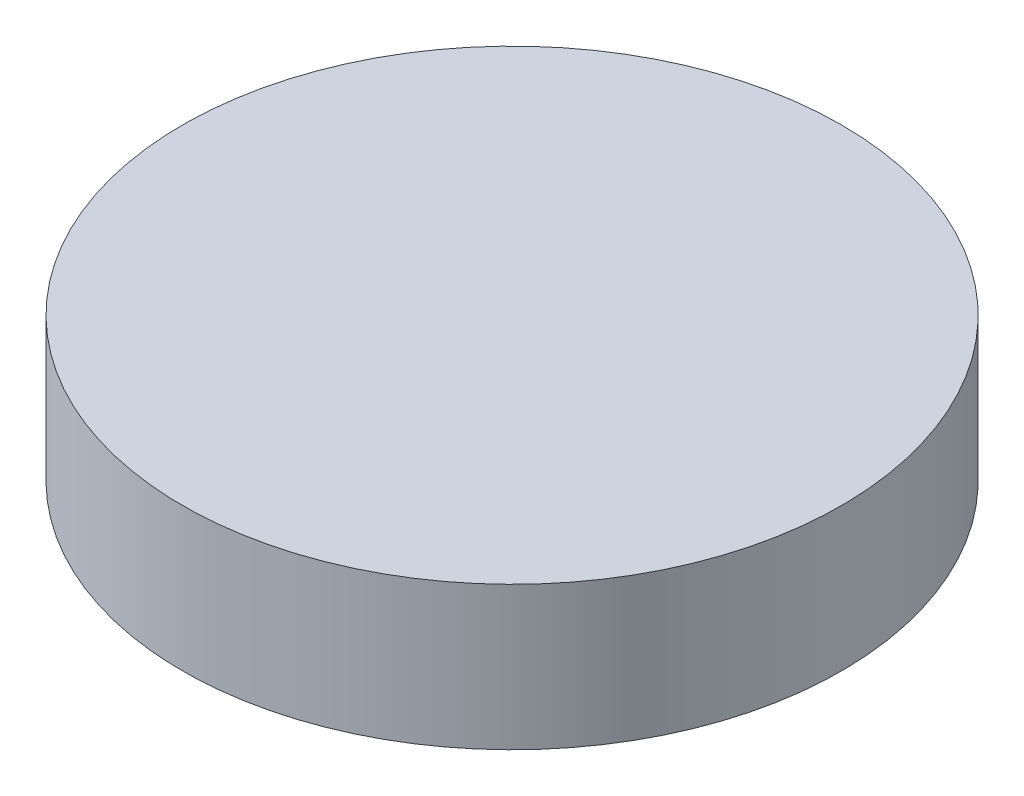
ISO-10303-21;
HEADER;
FILE_DESCRIPTION(('STEP AP214'),'2;1');
FILE_NAME('part.step','',(''),(''),'','','');
FILE_SCHEMA(('AUTOMOTIVE_DESIGN { 1 0 10303 214 1 1 1 1 }'));
ENDSEC;
DATA;
#1=APPLICATION_CONTEXT('core data for automotive mechanical design processes');
#2=APPLICATION_PROTOCOL_DEFINITION('international standard','automotive_design',2000,#1);
#3=PRODUCT_CONTEXT('',#1,'mechanical');
#4=PRODUCT('Part','Part','',(#3));
#5=PRODUCT_RELATED_PRODUCT_CATEGORY('part','',(#4));
#6=PRODUCT_DEFINITION_FORMATION('','',#4);
#7=PRODUCT_DEFINITION_CONTEXT('part definition',#1,'design');
#8=PRODUCT_DEFINITION('design','',#6,#7);
#9=PRODUCT_DEFINITION_SHAPE('','',#8);
#10=(LENGTH_UNIT() NAMED_UNIT(*) SI_UNIT(.MILLI.,.METRE.));
#11=(NAMED_UNIT(*) PLANE_ANGLE_UNIT() SI_UNIT($,.RADIAN.));
#12=(NAMED_UNIT(*) SI_UNIT($,.STERADIAN.) SOLID_ANGLE_UNIT());
#13=UNCERTAINTY_MEASURE_WITH_UNIT(LENGTH_MEASURE(1.E-05),#10,'distance_accuracy_value','');
#14=(GEOMETRIC_REPRESENTATION_CONTEXT(3) GLOBAL_UNCERTAINTY_ASSIGNED_CONTEXT((#13)) GLOBAL_UNIT_ASSIGNED_CONTEXT((#10,
#11,#12)) REPRESENTATION_CONTEXT('',''));
#15=CARTESIAN_POINT('',(0.,0.,0.));
#16=DIRECTION('',(0.,0.,1.));
#17=DIRECTION('',(1.,0.,0.));
#18=AXIS2_PLACEMENT_3D('',#15,#16,#17);
#19=CARTESIAN_POINT('',(0.,0.,0.));
#20=DIRECTION('',(0.,-1.,0.));
#21=DIRECTION('',(0.,0.,-1.));
#22=AXIS2_PLACEMENT_3D('',#19,#20,#21);
#23=PLANE('',#22);
#24=CARTESIAN_POINT('',(0.,0.,0.));
#25=DIRECTION('',(0.,-1.,0.));
#26=DIRECTION('',(0.,0.,-1.));
#27=AXIS2_PLACEMENT_3D('',#24,#25,#26);
#28=CIRCLE('',#27,11.5);
#29=CARTESIAN_POINT('',(0.,0.,-11.5));
#30=VERTEX_POINT('',#29);
#31=EDGE_CURVE('E10',#30,#30,#28,.T.);
#32=ORIENTED_EDGE('',*,*,#31,.T.);
#33=EDGE_LOOP('',(#32));
#34=FACE_BOUND('',#33,.T.);
#35=ADVANCED_FACE('F37',(#34),#23,.T.);
#36=CARTESIAN_POINT('',(0.,0.,0.));
#37=DIRECTION('',(0.,-1.,0.));
#38=DIRECTION('',(0.,0.,-1.));
#39=AXIS2_PLACEMENT_3D('',#36,#37,#38);
#40=CYLINDRICAL_SURFACE('',#39,11.5);
#41=CARTESIAN_POINT('',(0.,5.,0.));
#42=DIRECTION('',(0.,-1.,0.));
#43=DIRECTION('',(0.,0.,-1.));
#44=AXIS2_PLACEMENT_3D('',#41,#42,#43);
#45=CIRCLE('',#44,11.5);
#46=CARTESIAN_POINT('',(0.,5.,-11.5));
#47=VERTEX_POINT('',#46);
#48=EDGE_CURVE('E43',#47,#47,#45,.T.);
#49=ORIENTED_EDGE('',*,*,#48,.T.);
#50=EDGE_LOOP('',(#49));
#51=FACE_BOUND('',#50,.T.);
#52=ORIENTED_EDGE('',*,*,#31,.F.);
#53=EDGE_LOOP('',(#52));
#54=FACE_BOUND('',#53,.T.);
#55=ADVANCED_FACE('F49',(#51,#54),#40,.T.);
#56=CARTESIAN_POINT('',(11.5,5.,0.));
#57=DIRECTION('',(0.,1.,0.));
#58=DIRECTION('',(0.,0.,1.));
#59=AXIS2_PLACEMENT_3D('',#56,#57,#58);
#60=PLANE('',#59);
#61=ORIENTED_EDGE('',*,*,#48,.F.);
#62=EDGE_LOOP('',(#61));
#63=FACE_BOUND('',#62,.T.);
#64=ADVANCED_FACE('F52',(#63),#60,.T.);
#65=CLOSED_SHELL('',(#35,#55,#64));
#66=MANIFOLD_SOLID_BREP('B2',#65);
#67=ADVANCED_BREP_SHAPE_REPRESENTATION('',(#18,#66),#14);
#68=SHAPE_DEFINITION_REPRESENTATION(#9,#67);
ENDSEC;
END-ISO-10303-21;
